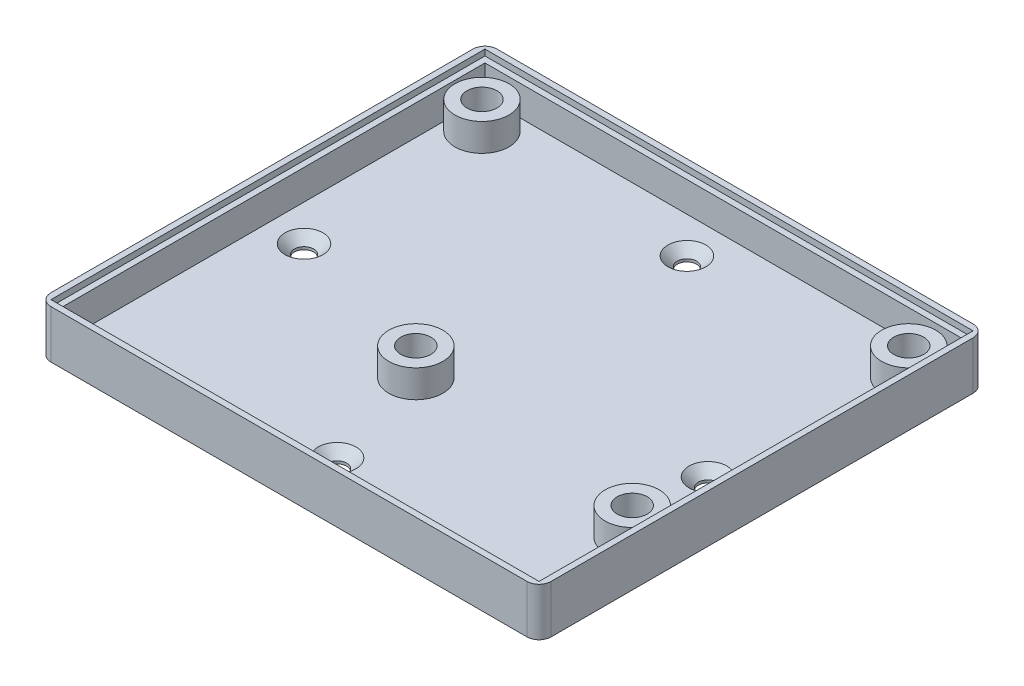
ISO-10303-21;
HEADER;
FILE_DESCRIPTION(('STEP AP214'),'2;1');
FILE_NAME('part.step','',(''),(''),'','','');
FILE_SCHEMA(('AUTOMOTIVE_DESIGN { 1 0 10303 214 1 1 1 1 }'));
ENDSEC;
DATA;
#1=APPLICATION_CONTEXT('core data for automotive mechanical design processes');
#2=APPLICATION_PROTOCOL_DEFINITION('international standard','automotive_design',2000,#1);
#3=PRODUCT_CONTEXT('',#1,'mechanical');
#4=PRODUCT('Part','Part','',(#3));
#5=PRODUCT_RELATED_PRODUCT_CATEGORY('part','',(#4));
#6=PRODUCT_DEFINITION_FORMATION('','',#4);
#7=PRODUCT_DEFINITION_CONTEXT('part definition',#1,'design');
#8=PRODUCT_DEFINITION('design','',#6,#7);
#9=PRODUCT_DEFINITION_SHAPE('','',#8);
#10=(LENGTH_UNIT() NAMED_UNIT(*) SI_UNIT(.MILLI.,.METRE.));
#11=(NAMED_UNIT(*) PLANE_ANGLE_UNIT() SI_UNIT($,.RADIAN.));
#12=(NAMED_UNIT(*) SI_UNIT($,.STERADIAN.) SOLID_ANGLE_UNIT());
#13=UNCERTAINTY_MEASURE_WITH_UNIT(LENGTH_MEASURE(1.E-05),#10,'distance_accuracy_value','');
#14=(GEOMETRIC_REPRESENTATION_CONTEXT(3) GLOBAL_UNCERTAINTY_ASSIGNED_CONTEXT((#13)) GLOBAL_UNIT_ASSIGNED_CONTEXT((#10,
#11,#12)) REPRESENTATION_CONTEXT('',''));
#15=CARTESIAN_POINT('',(0.,0.,0.));
#16=DIRECTION('',(0.,0.,1.));
#17=DIRECTION('',(1.,0.,0.));
#18=AXIS2_PLACEMENT_3D('',#15,#16,#17);
#19=CARTESIAN_POINT('',(0.,2.,0.));
#20=DIRECTION('',(0.,-1.,0.));
#21=DIRECTION('',(0.,0.,-1.));
#22=AXIS2_PLACEMENT_3D('',#19,#20,#21);
#23=PLANE('',#22);
#24=CARTESIAN_POINT('',(41.6,2.,-66.2));
#25=DIRECTION('',(0.,1.,0.));
#26=DIRECTION('',(0.,0.,1.));
#27=AXIS2_PLACEMENT_3D('',#24,#25,#26);
#28=CIRCLE('',#27,3.15);
#29=CARTESIAN_POINT('',(41.6,2.,-63.05));
#30=VERTEX_POINT('',#29);
#31=EDGE_CURVE('E1157',#30,#30,#28,.T.);
#32=ORIENTED_EDGE('',*,*,#31,.F.);
#33=EDGE_LOOP('',(#32));
#34=FACE_BOUND('',#33,.T.);
#35=CARTESIAN_POINT('',(8.,2.,-36.1));
#36=DIRECTION('',(0.,1.,0.));
#37=DIRECTION('',(0.,0.,1.));
#38=AXIS2_PLACEMENT_3D('',#35,#36,#37);
#39=CIRCLE('',#38,3.15);
#40=CARTESIAN_POINT('',(8.,2.,-32.95));
#41=VERTEX_POINT('',#40);
#42=EDGE_CURVE('E1145',#41,#41,#39,.T.);
#43=ORIENTED_EDGE('',*,*,#42,.F.);
#44=EDGE_LOOP('',(#43));
#45=FACE_BOUND('',#44,.T.);
#46=CARTESIAN_POINT('',(41.6,2.,-8.));
#47=DIRECTION('',(0.,1.,0.));
#48=DIRECTION('',(0.,0.,1.));
#49=AXIS2_PLACEMENT_3D('',#46,#47,#48);
#50=CIRCLE('',#49,3.15);
#51=CARTESIAN_POINT('',(41.6,2.,-4.85));
#52=VERTEX_POINT('',#51);
#53=EDGE_CURVE('E1092',#52,#52,#50,.T.);
#54=ORIENTED_EDGE('',*,*,#53,.F.);
#55=EDGE_LOOP('',(#54));
#56=FACE_BOUND('',#55,.T.);
#57=CARTESIAN_POINT('',(77.6,2.,-21.1));
#58=DIRECTION('',(0.,-1.,0.));
#59=DIRECTION('',(0.,0.,-1.));
#60=AXIS2_PLACEMENT_3D('',#57,#58,#59);
#61=CIRCLE('',#60,4.5);
#62=CARTESIAN_POINT('',(81.2,2.,-23.8));
#63=VERTEX_POINT('',#62);
#64=CARTESIAN_POINT('',(81.2,2.,-18.4));
#65=VERTEX_POINT('',#64);
#66=EDGE_CURVE('E373',#63,#65,#61,.F.);
#67=ORIENTED_EDGE('',*,*,#66,.F.);
#68=DIRECTION('',(0.,0.,-1.));
#69=VECTOR('',#68,1.);
#70=CARTESIAN_POINT('',(81.2,2.,0.));
#71=LINE('',#70,#69);
#72=CARTESIAN_POINT('',(81.2,2.,-64.4));
#73=VERTEX_POINT('',#72);
#74=EDGE_CURVE('E324',#63,#73,#71,.T.);
#75=ORIENTED_EDGE('',*,*,#74,.T.);
#76=CARTESIAN_POINT('',(77.6,2.,-67.1));
#77=DIRECTION('',(0.,-1.,0.));
#78=DIRECTION('',(0.,0.,-1.));
#79=AXIS2_PLACEMENT_3D('',#76,#77,#78);
#80=CIRCLE('',#79,4.50000000000001);
#81=CARTESIAN_POINT('',(81.2,2.,-69.8));
#82=VERTEX_POINT('',#81);
#83=EDGE_CURVE('E366',#82,#73,#80,.F.);
#84=ORIENTED_EDGE('',*,*,#83,.F.);
#85=CARTESIAN_POINT('',(81.2,2.,-72.2));
#86=VERTEX_POINT('',#85);
#87=EDGE_CURVE('E318',#82,#86,#71,.T.);
#88=ORIENTED_EDGE('',*,*,#87,.T.);
#89=DIRECTION('',(-1.,0.,0.));
#90=VECTOR('',#89,1.);
#91=CARTESIAN_POINT('',(0.,2.,-72.2));
#92=LINE('',#91,#90);
#93=CARTESIAN_POINT('',(2.,2.,-72.2));
#94=VERTEX_POINT('',#93);
#95=EDGE_CURVE('E314',#86,#94,#92,.T.);
#96=ORIENTED_EDGE('',*,*,#95,.T.);
#97=DIRECTION('',(0.,0.,1.));
#98=VECTOR('',#97,1.);
#99=CARTESIAN_POINT('',(2.,2.,0.));
#100=LINE('',#99,#98);
#101=CARTESIAN_POINT('',(2.,2.,-2.));
#102=VERTEX_POINT('',#101);
#103=EDGE_CURVE('E300',#94,#102,#100,.T.);
#104=ORIENTED_EDGE('',*,*,#103,.T.);
#105=DIRECTION('',(1.,0.,0.));
#106=VECTOR('',#105,1.);
#107=CARTESIAN_POINT('',(0.,2.,-2.));
#108=LINE('',#107,#106);
#109=CARTESIAN_POINT('',(81.2,2.,-2.));
#110=VERTEX_POINT('',#109);
#111=EDGE_CURVE('E304',#102,#110,#108,.T.);
#112=ORIENTED_EDGE('',*,*,#111,.T.);
#113=EDGE_CURVE('E321',#110,#65,#71,.T.);
#114=ORIENTED_EDGE('',*,*,#113,.T.);
#115=EDGE_LOOP('',(#67,#75,#84,#88,#96,#104,#112,#114));
#116=FACE_BOUND('',#115,.T.);
#117=CARTESIAN_POINT('',(36.6,2.,-26.1));
#118=DIRECTION('',(0.,-1.,0.));
#119=DIRECTION('',(0.,0.,-1.));
#120=AXIS2_PLACEMENT_3D('',#117,#118,#119);
#121=CIRCLE('',#120,4.5);
#122=CARTESIAN_POINT('',(36.6,2.,-30.6));
#123=VERTEX_POINT('',#122);
#124=EDGE_CURVE('E362',#123,#123,#121,.F.);
#125=ORIENTED_EDGE('',*,*,#124,.F.);
#126=EDGE_LOOP('',(#125));
#127=FACE_BOUND('',#126,.T.);
#128=CARTESIAN_POINT('',(6.6,2.,-67.1));
#129=DIRECTION('',(0.,-1.,0.));
#130=DIRECTION('',(0.,0.,-1.));
#131=AXIS2_PLACEMENT_3D('',#128,#129,#130);
#132=CIRCLE('',#131,4.5);
#133=CARTESIAN_POINT('',(6.6,2.,-71.6));
#134=VERTEX_POINT('',#133);
#135=EDGE_CURVE('E345',#134,#134,#132,.F.);
#136=ORIENTED_EDGE('',*,*,#135,.F.);
#137=EDGE_LOOP('',(#136));
#138=FACE_BOUND('',#137,.T.);
#139=CARTESIAN_POINT('',(75.2,2.,-36.1));
#140=DIRECTION('',(0.,1.,0.));
#141=DIRECTION('',(0.,0.,1.));
#142=AXIS2_PLACEMENT_3D('',#139,#140,#141);
#143=CIRCLE('',#142,3.15);
#144=CARTESIAN_POINT('',(75.2,2.,-32.95));
#145=VERTEX_POINT('',#144);
#146=EDGE_CURVE('E1073',#145,#145,#143,.T.);
#147=ORIENTED_EDGE('',*,*,#146,.F.);
#148=EDGE_LOOP('',(#147));
#149=FACE_BOUND('',#148,.T.);
#150=ADVANCED_FACE('F46',(#34,#45,#56,#116,#127,#138,#149),#23,.F.);
#151=CARTESIAN_POINT('',(81.2,8.,0.));
#152=DIRECTION('',(-1.,0.,0.));
#153=DIRECTION('',(0.,0.,1.));
#154=AXIS2_PLACEMENT_3D('',#151,#152,#153);
#155=PLANE('',#154);
#156=DIRECTION('',(0.,-1.,0.));
#157=VECTOR('',#156,1.);
#158=CARTESIAN_POINT('',(81.2,8.,-2.));
#159=LINE('',#158,#157);
#160=CARTESIAN_POINT('',(81.2,7.,-2.));
#161=VERTEX_POINT('',#160);
#162=EDGE_CURVE('E309',#161,#110,#159,.T.);
#163=ORIENTED_EDGE('',*,*,#162,.F.);
#164=DIRECTION('',(0.,0.,-1.));
#165=VECTOR('',#164,1.);
#166=CARTESIAN_POINT('',(81.2,7.,0.));
#167=LINE('',#166,#165);
#168=CARTESIAN_POINT('',(81.2,7.,-72.2));
#169=VERTEX_POINT('',#168);
#170=EDGE_CURVE('E246',#161,#169,#167,.T.);
#171=ORIENTED_EDGE('',*,*,#170,.T.);
#172=DIRECTION('',(0.,-1.,0.));
#173=VECTOR('',#172,1.);
#174=CARTESIAN_POINT('',(81.2,8.,-72.2));
#175=LINE('',#174,#173);
#176=EDGE_CURVE('E313',#169,#86,#175,.T.);
#177=ORIENTED_EDGE('',*,*,#176,.T.);
#178=ORIENTED_EDGE('',*,*,#87,.F.);
#179=DIRECTION('',(0.,-1.,0.));
#180=VECTOR('',#179,1.);
#181=CARTESIAN_POINT('',(81.2,20.7279220613579,-69.8));
#182=LINE('',#181,#180);
#183=CARTESIAN_POINT('',(81.2,6.6,-69.8));
#184=VERTEX_POINT('',#183);
#185=EDGE_CURVE('E281',#82,#184,#182,.F.);
#186=ORIENTED_EDGE('',*,*,#185,.T.);
#187=DIRECTION('',(0.,0.,1.));
#188=VECTOR('',#187,1.);
#189=CARTESIAN_POINT('',(81.2,6.6,0.));
#190=LINE('',#189,#188);
#191=CARTESIAN_POINT('',(81.2,6.6,-64.4));
#192=VERTEX_POINT('',#191);
#193=EDGE_CURVE('E370',#184,#192,#190,.T.);
#194=ORIENTED_EDGE('',*,*,#193,.T.);
#195=DIRECTION('',(0.,-1.,0.));
#196=VECTOR('',#195,1.);
#197=CARTESIAN_POINT('',(81.2,20.7279220613579,-64.4));
#198=LINE('',#197,#196);
#199=EDGE_CURVE('E277',#192,#73,#198,.T.);
#200=ORIENTED_EDGE('',*,*,#199,.T.);
#201=ORIENTED_EDGE('',*,*,#74,.F.);
#202=DIRECTION('',(0.,-1.,0.));
#203=VECTOR('',#202,1.);
#204=CARTESIAN_POINT('',(81.2,20.7279220613579,-23.8));
#205=LINE('',#204,#203);
#206=CARTESIAN_POINT('',(81.2,6.6,-23.8));
#207=VERTEX_POINT('',#206);
#208=EDGE_CURVE('E266',#63,#207,#205,.F.);
#209=ORIENTED_EDGE('',*,*,#208,.T.);
#210=DIRECTION('',(0.,0.,1.));
#211=VECTOR('',#210,1.);
#212=CARTESIAN_POINT('',(81.2,6.6,0.));
#213=LINE('',#212,#211);
#214=CARTESIAN_POINT('',(81.2,6.6,-18.4));
#215=VERTEX_POINT('',#214);
#216=EDGE_CURVE('E377',#207,#215,#213,.T.);
#217=ORIENTED_EDGE('',*,*,#216,.T.);
#218=DIRECTION('',(0.,-1.,0.));
#219=VECTOR('',#218,1.);
#220=CARTESIAN_POINT('',(81.2,20.7279220613579,-18.4));
#221=LINE('',#220,#219);
#222=EDGE_CURVE('E262',#215,#65,#221,.T.);
#223=ORIENTED_EDGE('',*,*,#222,.T.);
#224=ORIENTED_EDGE('',*,*,#113,.F.);
#225=EDGE_LOOP('',(#163,#171,#177,#178,#186,#194,#200,#201,#209,#217,#223,#224));
#226=FACE_BOUND('',#225,.T.);
#227=ADVANCED_FACE('F483',(#226),#155,.T.);
#228=CARTESIAN_POINT('',(2.,8.,0.));
#229=DIRECTION('',(1.,0.,0.));
#230=DIRECTION('',(0.,0.,-1.));
#231=AXIS2_PLACEMENT_3D('',#228,#229,#230);
#232=PLANE('',#231);
#233=DIRECTION('',(0.,-1.,0.));
#234=VECTOR('',#233,1.);
#235=CARTESIAN_POINT('',(2.,8.,-72.2));
#236=LINE('',#235,#234);
#237=CARTESIAN_POINT('',(2.,7.,-72.2));
#238=VERTEX_POINT('',#237);
#239=EDGE_CURVE('E310',#238,#94,#236,.T.);
#240=ORIENTED_EDGE('',*,*,#239,.F.);
#241=DIRECTION('',(0.,0.,1.));
#242=VECTOR('',#241,1.);
#243=CARTESIAN_POINT('',(2.,7.,0.));
#244=LINE('',#243,#242);
#245=CARTESIAN_POINT('',(2.,7.,-2.));
#246=VERTEX_POINT('',#245);
#247=EDGE_CURVE('E237',#238,#246,#244,.T.);
#248=ORIENTED_EDGE('',*,*,#247,.T.);
#249=DIRECTION('',(0.,-1.,0.));
#250=VECTOR('',#249,1.);
#251=CARTESIAN_POINT('',(2.,8.,-2.));
#252=LINE('',#251,#250);
#253=EDGE_CURVE('E305',#246,#102,#252,.T.);
#254=ORIENTED_EDGE('',*,*,#253,.T.);
#255=ORIENTED_EDGE('',*,*,#103,.F.);
#256=EDGE_LOOP('',(#240,#248,#254,#255));
#257=FACE_BOUND('',#256,.T.);
#258=ADVANCED_FACE('F491',(#257),#232,.T.);
#259=CARTESIAN_POINT('',(0.,8.,-2.));
#260=DIRECTION('',(0.,0.,-1.));
#261=DIRECTION('',(-1.,0.,0.));
#262=AXIS2_PLACEMENT_3D('',#259,#260,#261);
#263=PLANE('',#262);
#264=ORIENTED_EDGE('',*,*,#253,.F.);
#265=DIRECTION('',(1.,0.,0.));
#266=VECTOR('',#265,1.);
#267=CARTESIAN_POINT('',(0.,7.,-2.));
#268=LINE('',#267,#266);
#269=EDGE_CURVE('E250',#246,#161,#268,.T.);
#270=ORIENTED_EDGE('',*,*,#269,.T.);
#271=ORIENTED_EDGE('',*,*,#162,.T.);
#272=ORIENTED_EDGE('',*,*,#111,.F.);
#273=EDGE_LOOP('',(#264,#270,#271,#272));
#274=FACE_BOUND('',#273,.T.);
#275=ADVANCED_FACE('F777',(#274),#263,.T.);
#276=CARTESIAN_POINT('',(0.,8.,-72.2));
#277=DIRECTION('',(0.,0.,1.));
#278=DIRECTION('',(1.,0.,0.));
#279=AXIS2_PLACEMENT_3D('',#276,#277,#278);
#280=PLANE('',#279);
#281=ORIENTED_EDGE('',*,*,#176,.F.);
#282=DIRECTION('',(-1.,0.,0.));
#283=VECTOR('',#282,1.);
#284=CARTESIAN_POINT('',(0.,7.,-72.2));
#285=LINE('',#284,#283);
#286=EDGE_CURVE('E380',#169,#238,#285,.T.);
#287=ORIENTED_EDGE('',*,*,#286,.T.);
#288=ORIENTED_EDGE('',*,*,#239,.T.);
#289=ORIENTED_EDGE('',*,*,#95,.F.);
#290=EDGE_LOOP('',(#281,#287,#288,#289));
#291=FACE_BOUND('',#290,.T.);
#292=ADVANCED_FACE('F498',(#291),#280,.T.);
#293=CARTESIAN_POINT('',(6.6,20.7279220613579,-67.1));
#294=DIRECTION('',(0.,-1.,0.));
#295=DIRECTION('',(0.,0.,-1.));
#296=AXIS2_PLACEMENT_3D('',#293,#294,#295);
#297=CYLINDRICAL_SURFACE('',#296,4.5);
#298=CARTESIAN_POINT('',(6.6,6.6,-67.1));
#299=DIRECTION('',(0.,-1.,0.));
#300=DIRECTION('',(0.,0.,-1.));
#301=AXIS2_PLACEMENT_3D('',#298,#299,#300);
#302=CIRCLE('',#301,4.5);
#303=CARTESIAN_POINT('',(6.6,6.6,-71.6));
#304=VERTEX_POINT('',#303);
#305=EDGE_CURVE('E292',#304,#304,#302,.T.);
#306=ORIENTED_EDGE('',*,*,#305,.T.);
#307=EDGE_LOOP('',(#306));
#308=FACE_BOUND('',#307,.T.);
#309=ORIENTED_EDGE('',*,*,#135,.T.);
#310=EDGE_LOOP('',(#309));
#311=FACE_BOUND('',#310,.T.);
#312=ADVANCED_FACE('F799',(#308,#311),#297,.T.);
#313=CARTESIAN_POINT('',(6.6,20.7279220613579,-67.1));
#314=DIRECTION('',(0.,-1.,0.));
#315=DIRECTION('',(0.,0.,-1.));
#316=AXIS2_PLACEMENT_3D('',#313,#314,#315);
#317=CYLINDRICAL_SURFACE('',#316,2.5);
#318=CARTESIAN_POINT('',(6.6,2.5,-67.1));
#319=DIRECTION('',(0.,1.,0.));
#320=DIRECTION('',(0.,0.,1.));
#321=AXIS2_PLACEMENT_3D('',#318,#319,#320);
#322=CIRCLE('',#321,2.5);
#323=CARTESIAN_POINT('',(6.6,2.5,-64.6));
#324=VERTEX_POINT('',#323);
#325=EDGE_CURVE('E384',#324,#324,#322,.T.);
#326=ORIENTED_EDGE('',*,*,#325,.F.);
#327=EDGE_LOOP('',(#326));
#328=FACE_BOUND('',#327,.T.);
#329=CARTESIAN_POINT('',(6.6,6.6,-67.1));
#330=DIRECTION('',(0.,-1.,0.));
#331=DIRECTION('',(0.,0.,-1.));
#332=AXIS2_PLACEMENT_3D('',#329,#330,#331);
#333=CIRCLE('',#332,2.5);
#334=CARTESIAN_POINT('',(6.6,6.6,-69.6));
#335=VERTEX_POINT('',#334);
#336=EDGE_CURVE('E296',#335,#335,#333,.T.);
#337=ORIENTED_EDGE('',*,*,#336,.F.);
#338=EDGE_LOOP('',(#337));
#339=FACE_BOUND('',#338,.T.);
#340=ADVANCED_FACE('F918',(#328,#339),#317,.F.);
#341=CARTESIAN_POINT('',(0.,6.6,0.));
#342=DIRECTION('',(0.,-1.,0.));
#343=DIRECTION('',(0.,0.,-1.));
#344=AXIS2_PLACEMENT_3D('',#341,#342,#343);
#345=PLANE('',#344);
#346=ORIENTED_EDGE('',*,*,#336,.T.);
#347=EDGE_LOOP('',(#346));
#348=FACE_BOUND('',#347,.T.);
#349=ORIENTED_EDGE('',*,*,#305,.F.);
#350=EDGE_LOOP('',(#349));
#351=FACE_BOUND('',#350,.T.);
#352=ADVANCED_FACE('F907',(#348,#351),#345,.F.);
#353=CARTESIAN_POINT('',(36.6,20.7279220613579,-26.1));
#354=DIRECTION('',(0.,-1.,0.));
#355=DIRECTION('',(0.,0.,-1.));
#356=AXIS2_PLACEMENT_3D('',#353,#354,#355);
#357=CYLINDRICAL_SURFACE('',#356,4.5);
#358=CARTESIAN_POINT('',(36.6,6.6,-26.1));
#359=DIRECTION('',(0.,-1.,0.));
#360=DIRECTION('',(0.,0.,-1.));
#361=AXIS2_PLACEMENT_3D('',#358,#359,#360);
#362=CIRCLE('',#361,4.5);
#363=CARTESIAN_POINT('',(36.6,6.6,-30.6));
#364=VERTEX_POINT('',#363);
#365=EDGE_CURVE('E288',#364,#364,#362,.T.);
#366=ORIENTED_EDGE('',*,*,#365,.T.);
#367=EDGE_LOOP('',(#366));
#368=FACE_BOUND('',#367,.T.);
#369=ORIENTED_EDGE('',*,*,#124,.T.);
#370=EDGE_LOOP('',(#369));
#371=FACE_BOUND('',#370,.T.);
#372=ADVANCED_FACE('F895',(#368,#371),#357,.T.);
#373=CARTESIAN_POINT('',(36.6,20.7279220613579,-26.1));
#374=DIRECTION('',(0.,-1.,0.));
#375=DIRECTION('',(0.,0.,-1.));
#376=AXIS2_PLACEMENT_3D('',#373,#374,#375);
#377=CYLINDRICAL_SURFACE('',#376,2.49999999999999);
#378=CARTESIAN_POINT('',(36.6,2.5,-26.1));
#379=DIRECTION('',(0.,1.,0.));
#380=DIRECTION('',(0.,0.,1.));
#381=AXIS2_PLACEMENT_3D('',#378,#379,#380);
#382=CIRCLE('',#381,2.49999999999999);
#383=CARTESIAN_POINT('',(36.6,2.5,-23.6));
#384=VERTEX_POINT('',#383);
#385=EDGE_CURVE('E392',#384,#384,#382,.T.);
#386=ORIENTED_EDGE('',*,*,#385,.F.);
#387=EDGE_LOOP('',(#386));
#388=FACE_BOUND('',#387,.T.);
#389=CARTESIAN_POINT('',(36.6,6.6,-26.1));
#390=DIRECTION('',(0.,-1.,0.));
#391=DIRECTION('',(0.,0.,-1.));
#392=AXIS2_PLACEMENT_3D('',#389,#390,#391);
#393=CIRCLE('',#392,2.49999999999999);
#394=CARTESIAN_POINT('',(36.6,6.6,-28.6));
#395=VERTEX_POINT('',#394);
#396=EDGE_CURVE('E284',#395,#395,#393,.T.);
#397=ORIENTED_EDGE('',*,*,#396,.F.);
#398=EDGE_LOOP('',(#397));
#399=FACE_BOUND('',#398,.T.);
#400=ADVANCED_FACE('F882',(#388,#399),#377,.F.);
#401=CARTESIAN_POINT('',(0.,6.6,0.));
#402=DIRECTION('',(0.,-1.,0.));
#403=DIRECTION('',(0.,0.,-1.));
#404=AXIS2_PLACEMENT_3D('',#401,#402,#403);
#405=PLANE('',#404);
#406=ORIENTED_EDGE('',*,*,#396,.T.);
#407=EDGE_LOOP('',(#406));
#408=FACE_BOUND('',#407,.T.);
#409=ORIENTED_EDGE('',*,*,#365,.F.);
#410=EDGE_LOOP('',(#409));
#411=FACE_BOUND('',#410,.T.);
#412=ADVANCED_FACE('F871',(#408,#411),#405,.F.);
#413=CARTESIAN_POINT('',(77.6,20.7279220613579,-67.1));
#414=DIRECTION('',(0.,-1.,0.));
#415=DIRECTION('',(0.,0.,-1.));
#416=AXIS2_PLACEMENT_3D('',#413,#414,#415);
#417=CYLINDRICAL_SURFACE('',#416,4.50000000000001);
#418=ORIENTED_EDGE('',*,*,#185,.F.);
#419=ORIENTED_EDGE('',*,*,#83,.T.);
#420=ORIENTED_EDGE('',*,*,#199,.F.);
#421=CARTESIAN_POINT('',(77.6,6.6,-67.1));
#422=DIRECTION('',(0.,-1.,0.));
#423=DIRECTION('',(0.,0.,-1.));
#424=AXIS2_PLACEMENT_3D('',#421,#422,#423);
#425=CIRCLE('',#424,4.50000000000001);
#426=EDGE_CURVE('E273',#192,#184,#425,.T.);
#427=ORIENTED_EDGE('',*,*,#426,.T.);
#428=EDGE_LOOP('',(#418,#419,#420,#427));
#429=FACE_BOUND('',#428,.T.);
#430=ADVANCED_FACE('F859',(#429),#417,.T.);
#431=CARTESIAN_POINT('',(77.6,20.7279220613579,-67.1));
#432=DIRECTION('',(0.,-1.,0.));
#433=DIRECTION('',(0.,0.,-1.));
#434=AXIS2_PLACEMENT_3D('',#431,#432,#433);
#435=CYLINDRICAL_SURFACE('',#434,2.50000000000001);
#436=CARTESIAN_POINT('',(77.6,2.5,-67.1));
#437=DIRECTION('',(0.,1.,0.));
#438=DIRECTION('',(0.,0.,1.));
#439=AXIS2_PLACEMENT_3D('',#436,#437,#438);
#440=CIRCLE('',#439,2.50000000000001);
#441=CARTESIAN_POINT('',(77.6,2.5,-64.6));
#442=VERTEX_POINT('',#441);
#443=EDGE_CURVE('E388',#442,#442,#440,.T.);
#444=ORIENTED_EDGE('',*,*,#443,.F.);
#445=EDGE_LOOP('',(#444));
#446=FACE_BOUND('',#445,.T.);
#447=CARTESIAN_POINT('',(77.6,6.6,-67.1));
#448=DIRECTION('',(0.,-1.,0.));
#449=DIRECTION('',(0.,0.,-1.));
#450=AXIS2_PLACEMENT_3D('',#447,#448,#449);
#451=CIRCLE('',#450,2.50000000000001);
#452=CARTESIAN_POINT('',(77.6,6.6,-69.6));
#453=VERTEX_POINT('',#452);
#454=EDGE_CURVE('E269',#453,#453,#451,.T.);
#455=ORIENTED_EDGE('',*,*,#454,.F.);
#456=EDGE_LOOP('',(#455));
#457=FACE_BOUND('',#456,.T.);
#458=ADVANCED_FACE('F846',(#446,#457),#435,.F.);
#459=CARTESIAN_POINT('',(0.,6.6,0.));
#460=DIRECTION('',(0.,-1.,0.));
#461=DIRECTION('',(0.,0.,-1.));
#462=AXIS2_PLACEMENT_3D('',#459,#460,#461);
#463=PLANE('',#462);
#464=ORIENTED_EDGE('',*,*,#193,.F.);
#465=ORIENTED_EDGE('',*,*,#426,.F.);
#466=EDGE_LOOP('',(#464,#465));
#467=FACE_BOUND('',#466,.T.);
#468=ORIENTED_EDGE('',*,*,#454,.T.);
#469=EDGE_LOOP('',(#468));
#470=FACE_BOUND('',#469,.T.);
#471=ADVANCED_FACE('F835',(#467,#470),#463,.F.);
#472=CARTESIAN_POINT('',(77.6,20.7279220613579,-21.1));
#473=DIRECTION('',(0.,-1.,0.));
#474=DIRECTION('',(0.,0.,-1.));
#475=AXIS2_PLACEMENT_3D('',#472,#473,#474);
#476=CYLINDRICAL_SURFACE('',#475,4.5);
#477=ORIENTED_EDGE('',*,*,#208,.F.);
#478=ORIENTED_EDGE('',*,*,#66,.T.);
#479=ORIENTED_EDGE('',*,*,#222,.F.);
#480=CARTESIAN_POINT('',(77.6,6.6,-21.1));
#481=DIRECTION('',(0.,-1.,0.));
#482=DIRECTION('',(0.,0.,-1.));
#483=AXIS2_PLACEMENT_3D('',#480,#481,#482);
#484=CIRCLE('',#483,4.5);
#485=EDGE_CURVE('E258',#215,#207,#484,.T.);
#486=ORIENTED_EDGE('',*,*,#485,.T.);
#487=EDGE_LOOP('',(#477,#478,#479,#486));
#488=FACE_BOUND('',#487,.T.);
#489=ADVANCED_FACE('F823',(#488),#476,.T.);
#490=CARTESIAN_POINT('',(77.6,20.7279220613579,-21.1));
#491=DIRECTION('',(0.,-1.,0.));
#492=DIRECTION('',(0.,0.,-1.));
#493=AXIS2_PLACEMENT_3D('',#490,#491,#492);
#494=CYLINDRICAL_SURFACE('',#493,2.50000000000001);
#495=CARTESIAN_POINT('',(77.6,2.5,-21.1));
#496=DIRECTION('',(0.,1.,0.));
#497=DIRECTION('',(0.,0.,1.));
#498=AXIS2_PLACEMENT_3D('',#495,#496,#497);
#499=CIRCLE('',#498,2.50000000000001);
#500=CARTESIAN_POINT('',(77.6,2.5,-18.6));
#501=VERTEX_POINT('',#500);
#502=EDGE_CURVE('E396',#501,#501,#499,.T.);
#503=ORIENTED_EDGE('',*,*,#502,.F.);
#504=EDGE_LOOP('',(#503));
#505=FACE_BOUND('',#504,.T.);
#506=CARTESIAN_POINT('',(77.6,6.6,-21.1));
#507=DIRECTION('',(0.,-1.,0.));
#508=DIRECTION('',(0.,0.,-1.));
#509=AXIS2_PLACEMENT_3D('',#506,#507,#508);
#510=CIRCLE('',#509,2.50000000000001);
#511=CARTESIAN_POINT('',(77.6,6.6,-23.6));
#512=VERTEX_POINT('',#511);
#513=EDGE_CURVE('E254',#512,#512,#510,.T.);
#514=ORIENTED_EDGE('',*,*,#513,.F.);
#515=EDGE_LOOP('',(#514));
#516=FACE_BOUND('',#515,.T.);
#517=ADVANCED_FACE('F811',(#505,#516),#494,.F.);
#518=CARTESIAN_POINT('',(0.,6.6,0.));
#519=DIRECTION('',(0.,-1.,0.));
#520=DIRECTION('',(0.,0.,-1.));
#521=AXIS2_PLACEMENT_3D('',#518,#519,#520);
#522=PLANE('',#521);
#523=ORIENTED_EDGE('',*,*,#216,.F.);
#524=ORIENTED_EDGE('',*,*,#485,.F.);
#525=EDGE_LOOP('',(#523,#524));
#526=FACE_BOUND('',#525,.T.);
#527=ORIENTED_EDGE('',*,*,#513,.T.);
#528=EDGE_LOOP('',(#527));
#529=FACE_BOUND('',#528,.T.);
#530=ADVANCED_FACE('F756',(#526,#529),#522,.F.);
#531=CARTESIAN_POINT('',(82.2,7.,-73.2));
#532=DIRECTION('',(0.,0.,-1.));
#533=DIRECTION('',(-1.,0.,0.));
#534=AXIS2_PLACEMENT_3D('',#531,#532,#533);
#535=PLANE('',#534);
#536=DIRECTION('',(-1.,0.,0.));
#537=VECTOR('',#536,1.);
#538=CARTESIAN_POINT('',(82.2,8.,-73.2));
#539=LINE('',#538,#537);
#540=CARTESIAN_POINT('',(82.2,8.,-73.2));
#541=VERTEX_POINT('',#540);
#542=CARTESIAN_POINT('',(1.,8.,-73.2));
#543=VERTEX_POINT('',#542);
#544=EDGE_CURVE('E192',#541,#543,#539,.T.);
#545=ORIENTED_EDGE('',*,*,#544,.T.);
#546=DIRECTION('',(0.,1.,0.));
#547=VECTOR('',#546,1.);
#548=CARTESIAN_POINT('',(1.,7.,-73.2));
#549=LINE('',#548,#547);
#550=CARTESIAN_POINT('',(1.,7.,-73.2));
#551=VERTEX_POINT('',#550);
#552=EDGE_CURVE('E185',#551,#543,#549,.T.);
#553=ORIENTED_EDGE('',*,*,#552,.F.);
#554=DIRECTION('',(-1.,0.,0.));
#555=VECTOR('',#554,1.);
#556=CARTESIAN_POINT('',(82.2,7.,-73.2));
#557=LINE('',#556,#555);
#558=CARTESIAN_POINT('',(82.2,7.,-73.2));
#559=VERTEX_POINT('',#558);
#560=EDGE_CURVE('E189',#559,#551,#557,.T.);
#561=ORIENTED_EDGE('',*,*,#560,.F.);
#562=DIRECTION('',(0.,1.,0.));
#563=VECTOR('',#562,1.);
#564=CARTESIAN_POINT('',(82.2,7.,-73.2));
#565=LINE('',#564,#563);
#566=EDGE_CURVE('E234',#559,#541,#565,.T.);
#567=ORIENTED_EDGE('',*,*,#566,.T.);
#568=EDGE_LOOP('',(#545,#553,#561,#567));
#569=FACE_BOUND('',#568,.T.);
#570=ADVANCED_FACE('F187',(#569),#535,.F.);
#571=CARTESIAN_POINT('',(82.2,7.,-1.));
#572=DIRECTION('',(1.,0.,0.));
#573=DIRECTION('',(0.,0.,-1.));
#574=AXIS2_PLACEMENT_3D('',#571,#572,#573);
#575=PLANE('',#574);
#576=DIRECTION('',(0.,0.,-1.));
#577=VECTOR('',#576,1.);
#578=CARTESIAN_POINT('',(82.2,8.,-1.));
#579=LINE('',#578,#577);
#580=CARTESIAN_POINT('',(82.2,8.,-1.));
#581=VERTEX_POINT('',#580);
#582=EDGE_CURVE('E212',#581,#541,#579,.T.);
#583=ORIENTED_EDGE('',*,*,#582,.T.);
#584=ORIENTED_EDGE('',*,*,#566,.F.);
#585=DIRECTION('',(0.,0.,-1.));
#586=VECTOR('',#585,1.);
#587=CARTESIAN_POINT('',(82.2,7.,-1.));
#588=LINE('',#587,#586);
#589=CARTESIAN_POINT('',(82.2,7.,-1.));
#590=VERTEX_POINT('',#589);
#591=EDGE_CURVE('E198',#590,#559,#588,.T.);
#592=ORIENTED_EDGE('',*,*,#591,.F.);
#593=DIRECTION('',(0.,1.,0.));
#594=VECTOR('',#593,1.);
#595=CARTESIAN_POINT('',(82.2,7.,-1.));
#596=LINE('',#595,#594);
#597=EDGE_CURVE('E238',#590,#581,#596,.T.);
#598=ORIENTED_EDGE('',*,*,#597,.T.);
#599=EDGE_LOOP('',(#583,#584,#592,#598));
#600=FACE_BOUND('',#599,.T.);
#601=ADVANCED_FACE('F733',(#600),#575,.F.);
#602=CARTESIAN_POINT('',(1.,7.,-1.));
#603=DIRECTION('',(0.,0.,1.));
#604=DIRECTION('',(1.,0.,0.));
#605=AXIS2_PLACEMENT_3D('',#602,#603,#604);
#606=PLANE('',#605);
#607=DIRECTION('',(1.,0.,0.));
#608=VECTOR('',#607,1.);
#609=CARTESIAN_POINT('',(1.,8.,-1.));
#610=LINE('',#609,#608);
#611=CARTESIAN_POINT('',(1.,8.,-1.));
#612=VERTEX_POINT('',#611);
#613=EDGE_CURVE('E216',#612,#581,#610,.T.);
#614=ORIENTED_EDGE('',*,*,#613,.T.);
#615=ORIENTED_EDGE('',*,*,#597,.F.);
#616=DIRECTION('',(1.,0.,0.));
#617=VECTOR('',#616,1.);
#618=CARTESIAN_POINT('',(1.,7.,-1.));
#619=LINE('',#618,#617);
#620=CARTESIAN_POINT('',(1.,7.,-1.));
#621=VERTEX_POINT('',#620);
#622=EDGE_CURVE('E207',#621,#590,#619,.T.);
#623=ORIENTED_EDGE('',*,*,#622,.F.);
#624=DIRECTION('',(0.,1.,0.));
#625=VECTOR('',#624,1.);
#626=CARTESIAN_POINT('',(1.,7.,-1.));
#627=LINE('',#626,#625);
#628=EDGE_CURVE('E197',#621,#612,#627,.T.);
#629=ORIENTED_EDGE('',*,*,#628,.T.);
#630=EDGE_LOOP('',(#614,#615,#623,#629));
#631=FACE_BOUND('',#630,.T.);
#632=ADVANCED_FACE('F722',(#631),#606,.F.);
#633=CARTESIAN_POINT('',(1.,7.,-73.2));
#634=DIRECTION('',(-1.,0.,0.));
#635=DIRECTION('',(0.,0.,1.));
#636=AXIS2_PLACEMENT_3D('',#633,#634,#635);
#637=PLANE('',#636);
#638=DIRECTION('',(0.,0.,1.));
#639=VECTOR('',#638,1.);
#640=CARTESIAN_POINT('',(1.,8.,-73.2));
#641=LINE('',#640,#639);
#642=EDGE_CURVE('E228',#543,#612,#641,.T.);
#643=ORIENTED_EDGE('',*,*,#642,.T.);
#644=ORIENTED_EDGE('',*,*,#628,.F.);
#645=DIRECTION('',(0.,0.,1.));
#646=VECTOR('',#645,1.);
#647=CARTESIAN_POINT('',(1.,7.,-73.2));
#648=LINE('',#647,#646);
#649=EDGE_CURVE('E201',#551,#621,#648,.T.);
#650=ORIENTED_EDGE('',*,*,#649,.F.);
#651=ORIENTED_EDGE('',*,*,#552,.T.);
#652=EDGE_LOOP('',(#643,#644,#650,#651));
#653=FACE_BOUND('',#652,.T.);
#654=ADVANCED_FACE('F202',(#653),#637,.F.);
#655=CARTESIAN_POINT('',(0.,7.,0.));
#656=DIRECTION('',(0.,1.,0.));
#657=DIRECTION('',(0.,0.,1.));
#658=AXIS2_PLACEMENT_3D('',#655,#656,#657);
#659=PLANE('',#658);
#660=ORIENTED_EDGE('',*,*,#247,.F.);
#661=ORIENTED_EDGE('',*,*,#286,.F.);
#662=ORIENTED_EDGE('',*,*,#170,.F.);
#663=ORIENTED_EDGE('',*,*,#269,.F.);
#664=EDGE_LOOP('',(#660,#661,#662,#663));
#665=FACE_BOUND('',#664,.T.);
#666=ORIENTED_EDGE('',*,*,#560,.T.);
#667=ORIENTED_EDGE('',*,*,#649,.T.);
#668=ORIENTED_EDGE('',*,*,#622,.T.);
#669=ORIENTED_EDGE('',*,*,#591,.T.);
#670=EDGE_LOOP('',(#666,#667,#668,#669));
#671=FACE_BOUND('',#670,.T.);
#672=ADVANCED_FACE('F209',(#665,#671),#659,.T.);
#673=CARTESIAN_POINT('',(0.,0.,0.));
#674=DIRECTION('',(0.,-1.,0.));
#675=DIRECTION('',(0.,0.,-1.));
#676=AXIS2_PLACEMENT_3D('',#673,#674,#675);
#677=PLANE('',#676);
#678=CARTESIAN_POINT('',(41.6,0.,-66.2));
#679=DIRECTION('',(0.,1.,0.));
#680=DIRECTION('',(0.,0.,1.));
#681=AXIS2_PLACEMENT_3D('',#678,#679,#680);
#682=CIRCLE('',#681,1.6);
#683=CARTESIAN_POINT('',(41.6,0.,-64.6));
#684=VERTEX_POINT('',#683);
#685=EDGE_CURVE('E1149',#684,#684,#682,.T.);
#686=ORIENTED_EDGE('',*,*,#685,.T.);
#687=EDGE_LOOP('',(#686));
#688=FACE_BOUND('',#687,.T.);
#689=CARTESIAN_POINT('',(8.,0.,-36.1));
#690=DIRECTION('',(0.,1.,0.));
#691=DIRECTION('',(0.,0.,1.));
#692=AXIS2_PLACEMENT_3D('',#689,#690,#691);
#693=CIRCLE('',#692,1.6);
#694=CARTESIAN_POINT('',(8.,0.,-34.5));
#695=VERTEX_POINT('',#694);
#696=EDGE_CURVE('E1077',#695,#695,#693,.T.);
#697=ORIENTED_EDGE('',*,*,#696,.T.);
#698=EDGE_LOOP('',(#697));
#699=FACE_BOUND('',#698,.T.);
#700=CARTESIAN_POINT('',(75.2,0.,-36.1));
#701=DIRECTION('',(0.,1.,0.));
#702=DIRECTION('',(0.,0.,1.));
#703=AXIS2_PLACEMENT_3D('',#700,#701,#702);
#704=CIRCLE('',#703,1.6);
#705=CARTESIAN_POINT('',(75.2,0.,-34.5));
#706=VERTEX_POINT('',#705);
#707=EDGE_CURVE('E1082',#706,#706,#704,.T.);
#708=ORIENTED_EDGE('',*,*,#707,.T.);
#709=EDGE_LOOP('',(#708));
#710=FACE_BOUND('',#709,.T.);
#711=CARTESIAN_POINT('',(41.6,0.,-8.));
#712=DIRECTION('',(0.,1.,0.));
#713=DIRECTION('',(0.,0.,1.));
#714=AXIS2_PLACEMENT_3D('',#711,#712,#713);
#715=CIRCLE('',#714,1.6);
#716=CARTESIAN_POINT('',(41.6,0.,-6.4));
#717=VERTEX_POINT('',#716);
#718=EDGE_CURVE('E219',#717,#717,#715,.T.);
#719=ORIENTED_EDGE('',*,*,#718,.T.);
#720=EDGE_LOOP('',(#719));
#721=FACE_BOUND('',#720,.T.);
#722=DIRECTION('',(0.,0.,1.));
#723=VECTOR('',#722,1.);
#724=CARTESIAN_POINT('',(0.,0.,0.));
#725=LINE('',#724,#723);
#726=CARTESIAN_POINT('',(0.,0.,-72.2));
#727=VERTEX_POINT('',#726);
#728=CARTESIAN_POINT('',(0.,0.,-2.));
#729=VERTEX_POINT('',#728);
#730=EDGE_CURVE('E308',#727,#729,#725,.T.);
#731=ORIENTED_EDGE('',*,*,#730,.F.);
#732=CARTESIAN_POINT('',(2.,0.,-72.2));
#733=DIRECTION('',(0.,-1.,0.));
#734=DIRECTION('',(0.,0.,-1.));
#735=AXIS2_PLACEMENT_3D('',#732,#733,#734);
#736=CIRCLE('',#735,2.);
#737=CARTESIAN_POINT('',(2.,0.,-74.2));
#738=VERTEX_POINT('',#737);
#739=EDGE_CURVE('E416',#727,#738,#736,.T.);
#740=ORIENTED_EDGE('',*,*,#739,.T.);
#741=DIRECTION('',(-1.,0.,0.));
#742=VECTOR('',#741,1.);
#743=CARTESIAN_POINT('',(0.,0.,-74.2));
#744=LINE('',#743,#742);
#745=CARTESIAN_POINT('',(81.2,0.,-74.2));
#746=VERTEX_POINT('',#745);
#747=EDGE_CURVE('E335',#746,#738,#744,.T.);
#748=ORIENTED_EDGE('',*,*,#747,.F.);
#749=CARTESIAN_POINT('',(81.2,0.,-72.2));
#750=DIRECTION('',(0.,-1.,0.));
#751=DIRECTION('',(0.,0.,-1.));
#752=AXIS2_PLACEMENT_3D('',#749,#750,#751);
#753=CIRCLE('',#752,2.);
#754=CARTESIAN_POINT('',(83.2,0.,-72.2));
#755=VERTEX_POINT('',#754);
#756=EDGE_CURVE('E413',#746,#755,#753,.T.);
#757=ORIENTED_EDGE('',*,*,#756,.T.);
#758=DIRECTION('',(0.,0.,-1.));
#759=VECTOR('',#758,1.);
#760=CARTESIAN_POINT('',(83.2,0.,0.));
#761=LINE('',#760,#759);
#762=CARTESIAN_POINT('',(83.2,0.,-2.));
#763=VERTEX_POINT('',#762);
#764=EDGE_CURVE('E353',#763,#755,#761,.T.);
#765=ORIENTED_EDGE('',*,*,#764,.F.);
#766=CARTESIAN_POINT('',(81.2,0.,-2.));
#767=DIRECTION('',(0.,-1.,0.));
#768=DIRECTION('',(0.,0.,-1.));
#769=AXIS2_PLACEMENT_3D('',#766,#767,#768);
#770=CIRCLE('',#769,2.);
#771=CARTESIAN_POINT('',(81.2,0.,0.));
#772=VERTEX_POINT('',#771);
#773=EDGE_CURVE('E410',#763,#772,#770,.T.);
#774=ORIENTED_EDGE('',*,*,#773,.T.);
#775=DIRECTION('',(1.,0.,0.));
#776=VECTOR('',#775,1.);
#777=CARTESIAN_POINT('',(0.,0.,0.));
#778=LINE('',#777,#776);
#779=CARTESIAN_POINT('',(2.,0.,0.));
#780=VERTEX_POINT('',#779);
#781=EDGE_CURVE('E349',#780,#772,#778,.T.);
#782=ORIENTED_EDGE('',*,*,#781,.F.);
#783=CARTESIAN_POINT('',(2.,0.,-2.));
#784=DIRECTION('',(0.,-1.,0.));
#785=DIRECTION('',(0.,0.,-1.));
#786=AXIS2_PLACEMENT_3D('',#783,#784,#785);
#787=CIRCLE('',#786,2.);
#788=EDGE_CURVE('E407',#780,#729,#787,.T.);
#789=ORIENTED_EDGE('',*,*,#788,.T.);
#790=EDGE_LOOP('',(#731,#740,#748,#757,#765,#774,#782,#789));
#791=FACE_BOUND('',#790,.T.);
#792=ADVANCED_FACE('F454',(#688,#699,#710,#721,#791),#677,.T.);
#793=CARTESIAN_POINT('',(0.,8.,-74.2));
#794=DIRECTION('',(0.,0.,1.));
#795=DIRECTION('',(1.,0.,0.));
#796=AXIS2_PLACEMENT_3D('',#793,#794,#795);
#797=PLANE('',#796);
#798=ORIENTED_EDGE('',*,*,#747,.T.);
#799=DIRECTION('',(0.,-1.,0.));
#800=VECTOR('',#799,1.);
#801=CARTESIAN_POINT('',(2.,8.,-74.2));
#802=LINE('',#801,#800);
#803=CARTESIAN_POINT('',(2.,8.,-74.2));
#804=VERTEX_POINT('',#803);
#805=EDGE_CURVE('E423',#738,#804,#802,.F.);
#806=ORIENTED_EDGE('',*,*,#805,.T.);
#807=DIRECTION('',(-1.,0.,0.));
#808=VECTOR('',#807,1.);
#809=CARTESIAN_POINT('',(0.,8.,-74.2));
#810=LINE('',#809,#808);
#811=CARTESIAN_POINT('',(81.2,8.,-74.2));
#812=VERTEX_POINT('',#811);
#813=EDGE_CURVE('E341',#812,#804,#810,.T.);
#814=ORIENTED_EDGE('',*,*,#813,.F.);
#815=DIRECTION('',(0.,-1.,0.));
#816=VECTOR('',#815,1.);
#817=CARTESIAN_POINT('',(81.2,8.,-74.2));
#818=LINE('',#817,#816);
#819=EDGE_CURVE('E419',#812,#746,#818,.T.);
#820=ORIENTED_EDGE('',*,*,#819,.T.);
#821=EDGE_LOOP('',(#798,#806,#814,#820));
#822=FACE_BOUND('',#821,.T.);
#823=ADVANCED_FACE('F468',(#822),#797,.F.);
#824=CARTESIAN_POINT('',(83.2,8.,0.));
#825=DIRECTION('',(-1.,0.,0.));
#826=DIRECTION('',(0.,0.,1.));
#827=AXIS2_PLACEMENT_3D('',#824,#825,#826);
#828=PLANE('',#827);
#829=ORIENTED_EDGE('',*,*,#764,.T.);
#830=DIRECTION('',(0.,-1.,0.));
#831=VECTOR('',#830,1.);
#832=CARTESIAN_POINT('',(83.2,8.,-72.2));
#833=LINE('',#832,#831);
#834=CARTESIAN_POINT('',(83.2,8.,-72.2));
#835=VERTEX_POINT('',#834);
#836=EDGE_CURVE('E62',#755,#835,#833,.F.);
#837=ORIENTED_EDGE('',*,*,#836,.T.);
#838=DIRECTION('',(0.,0.,-1.));
#839=VECTOR('',#838,1.);
#840=CARTESIAN_POINT('',(83.2,8.,0.));
#841=LINE('',#840,#839);
#842=CARTESIAN_POINT('',(83.2,8.,-2.));
#843=VERTEX_POINT('',#842);
#844=EDGE_CURVE('E338',#843,#835,#841,.T.);
#845=ORIENTED_EDGE('',*,*,#844,.F.);
#846=DIRECTION('',(0.,-1.,0.));
#847=VECTOR('',#846,1.);
#848=CARTESIAN_POINT('',(83.2,8.,-2.));
#849=LINE('',#848,#847);
#850=EDGE_CURVE('E437',#843,#763,#849,.T.);
#851=ORIENTED_EDGE('',*,*,#850,.T.);
#852=EDGE_LOOP('',(#829,#837,#845,#851));
#853=FACE_BOUND('',#852,.T.);
#854=ADVANCED_FACE('F459',(#853),#828,.F.);
#855=CARTESIAN_POINT('',(0.,8.,0.));
#856=DIRECTION('',(0.,0.,-1.));
#857=DIRECTION('',(-1.,0.,0.));
#858=AXIS2_PLACEMENT_3D('',#855,#856,#857);
#859=PLANE('',#858);
#860=ORIENTED_EDGE('',*,*,#781,.T.);
#861=DIRECTION('',(0.,-1.,0.));
#862=VECTOR('',#861,1.);
#863=CARTESIAN_POINT('',(81.2,8.,0.));
#864=LINE('',#863,#862);
#865=CARTESIAN_POINT('',(81.2,8.,0.));
#866=VERTEX_POINT('',#865);
#867=EDGE_CURVE('E12',#772,#866,#864,.F.);
#868=ORIENTED_EDGE('',*,*,#867,.T.);
#869=DIRECTION('',(1.,0.,0.));
#870=VECTOR('',#869,1.);
#871=CARTESIAN_POINT('',(0.,8.,0.));
#872=LINE('',#871,#870);
#873=CARTESIAN_POINT('',(2.,8.,0.));
#874=VERTEX_POINT('',#873);
#875=EDGE_CURVE('E334',#874,#866,#872,.T.);
#876=ORIENTED_EDGE('',*,*,#875,.F.);
#877=DIRECTION('',(0.,-1.,0.));
#878=VECTOR('',#877,1.);
#879=CARTESIAN_POINT('',(2.,8.,0.));
#880=LINE('',#879,#878);
#881=EDGE_CURVE('E55',#874,#780,#880,.T.);
#882=ORIENTED_EDGE('',*,*,#881,.T.);
#883=EDGE_LOOP('',(#860,#868,#876,#882));
#884=FACE_BOUND('',#883,.T.);
#885=ADVANCED_FACE('F448',(#884),#859,.F.);
#886=CARTESIAN_POINT('',(0.,8.,0.));
#887=DIRECTION('',(1.,0.,0.));
#888=DIRECTION('',(0.,0.,-1.));
#889=AXIS2_PLACEMENT_3D('',#886,#887,#888);
#890=PLANE('',#889);
#891=DIRECTION('',(0.,0.,1.));
#892=VECTOR('',#891,1.);
#893=CARTESIAN_POINT('',(0.,8.,0.));
#894=LINE('',#893,#892);
#895=CARTESIAN_POINT('',(0.,8.,-72.2));
#896=VERTEX_POINT('',#895);
#897=CARTESIAN_POINT('',(0.,8.,-2.));
#898=VERTEX_POINT('',#897);
#899=EDGE_CURVE('E330',#896,#898,#894,.T.);
#900=ORIENTED_EDGE('',*,*,#899,.F.);
#901=DIRECTION('',(0.,-1.,0.));
#902=VECTOR('',#901,1.);
#903=CARTESIAN_POINT('',(0.,8.,-72.2));
#904=LINE('',#903,#902);
#905=EDGE_CURVE('E403',#896,#727,#904,.T.);
#906=ORIENTED_EDGE('',*,*,#905,.T.);
#907=ORIENTED_EDGE('',*,*,#730,.T.);
#908=DIRECTION('',(0.,-1.,0.));
#909=VECTOR('',#908,1.);
#910=CARTESIAN_POINT('',(0.,8.,-2.));
#911=LINE('',#910,#909);
#912=EDGE_CURVE('E400',#729,#898,#911,.F.);
#913=ORIENTED_EDGE('',*,*,#912,.T.);
#914=EDGE_LOOP('',(#900,#906,#907,#913));
#915=FACE_BOUND('',#914,.T.);
#916=ADVANCED_FACE('F476',(#915),#890,.F.);
#917=CARTESIAN_POINT('',(0.,8.,0.));
#918=DIRECTION('',(0.,-1.,0.));
#919=DIRECTION('',(0.,0.,-1.));
#920=AXIS2_PLACEMENT_3D('',#917,#918,#919);
#921=PLANE('',#920);
#922=ORIENTED_EDGE('',*,*,#642,.F.);
#923=ORIENTED_EDGE('',*,*,#544,.F.);
#924=ORIENTED_EDGE('',*,*,#582,.F.);
#925=ORIENTED_EDGE('',*,*,#613,.F.);
#926=EDGE_LOOP('',(#922,#923,#924,#925));
#927=FACE_BOUND('',#926,.T.);
#928=ORIENTED_EDGE('',*,*,#813,.T.);
#929=CARTESIAN_POINT('',(2.,8.,-72.2));
#930=DIRECTION('',(0.,-1.,0.));
#931=DIRECTION('',(0.,0.,-1.));
#932=AXIS2_PLACEMENT_3D('',#929,#930,#931);
#933=CIRCLE('',#932,2.);
#934=EDGE_CURVE('E434',#804,#896,#933,.F.);
#935=ORIENTED_EDGE('',*,*,#934,.T.);
#936=ORIENTED_EDGE('',*,*,#899,.T.);
#937=CARTESIAN_POINT('',(2.,8.,-2.));
#938=DIRECTION('',(0.,-1.,0.));
#939=DIRECTION('',(0.,0.,-1.));
#940=AXIS2_PLACEMENT_3D('',#937,#938,#939);
#941=CIRCLE('',#940,2.);
#942=EDGE_CURVE('E426',#898,#874,#941,.F.);
#943=ORIENTED_EDGE('',*,*,#942,.T.);
#944=ORIENTED_EDGE('',*,*,#875,.T.);
#945=CARTESIAN_POINT('',(81.2,8.,-2.));
#946=DIRECTION('',(0.,-1.,0.));
#947=DIRECTION('',(0.,0.,-1.));
#948=AXIS2_PLACEMENT_3D('',#945,#946,#947);
#949=CIRCLE('',#948,2.);
#950=EDGE_CURVE('E69',#866,#843,#949,.F.);
#951=ORIENTED_EDGE('',*,*,#950,.T.);
#952=ORIENTED_EDGE('',*,*,#844,.T.);
#953=CARTESIAN_POINT('',(81.2,8.,-72.2));
#954=DIRECTION('',(0.,-1.,0.));
#955=DIRECTION('',(0.,0.,-1.));
#956=AXIS2_PLACEMENT_3D('',#953,#954,#955);
#957=CIRCLE('',#956,2.);
#958=EDGE_CURVE('E431',#835,#812,#957,.F.);
#959=ORIENTED_EDGE('',*,*,#958,.T.);
#960=EDGE_LOOP('',(#928,#935,#936,#943,#944,#951,#952,#959));
#961=FACE_BOUND('',#960,.T.);
#962=ADVANCED_FACE('F461',(#927,#961),#921,.F.);
#963=CARTESIAN_POINT('',(6.6,2.5,-67.1));
#964=DIRECTION('',(0.,1.,0.));
#965=DIRECTION('',(0.,0.,1.));
#966=AXIS2_PLACEMENT_3D('',#963,#964,#965);
#967=PLANE('',#966);
#968=ORIENTED_EDGE('',*,*,#325,.T.);
#969=EDGE_LOOP('',(#968));
#970=FACE_BOUND('',#969,.T.);
#971=ADVANCED_FACE('F501',(#970),#967,.T.);
#972=CARTESIAN_POINT('',(77.6,2.5,-67.1));
#973=DIRECTION('',(0.,1.,0.));
#974=DIRECTION('',(0.,0.,1.));
#975=AXIS2_PLACEMENT_3D('',#972,#973,#974);
#976=PLANE('',#975);
#977=ORIENTED_EDGE('',*,*,#443,.T.);
#978=EDGE_LOOP('',(#977));
#979=FACE_BOUND('',#978,.T.);
#980=ADVANCED_FACE('F675',(#979),#976,.T.);
#981=CARTESIAN_POINT('',(36.6,2.5,-26.1));
#982=DIRECTION('',(0.,1.,0.));
#983=DIRECTION('',(0.,0.,1.));
#984=AXIS2_PLACEMENT_3D('',#981,#982,#983);
#985=PLANE('',#984);
#986=ORIENTED_EDGE('',*,*,#385,.T.);
#987=EDGE_LOOP('',(#986));
#988=FACE_BOUND('',#987,.T.);
#989=ADVANCED_FACE('F664',(#988),#985,.T.);
#990=CARTESIAN_POINT('',(77.6,2.5,-21.1));
#991=DIRECTION('',(0.,1.,0.));
#992=DIRECTION('',(0.,0.,1.));
#993=AXIS2_PLACEMENT_3D('',#990,#991,#992);
#994=PLANE('',#993);
#995=ORIENTED_EDGE('',*,*,#502,.T.);
#996=EDGE_LOOP('',(#995));
#997=FACE_BOUND('',#996,.T.);
#998=ADVANCED_FACE('F645',(#997),#994,.T.);
#999=CARTESIAN_POINT('',(41.6,2.,-8.));
#1000=DIRECTION('',(0.,1.,0.));
#1001=DIRECTION('',(0.,0.,1.));
#1002=AXIS2_PLACEMENT_3D('',#999,#1000,#1001);
#1003=CYLINDRICAL_SURFACE('',#1002,1.6);
#1004=ORIENTED_EDGE('',*,*,#718,.F.);
#1005=EDGE_LOOP('',(#1004));
#1006=FACE_BOUND('',#1005,.T.);
#1007=CARTESIAN_POINT('',(41.6,0.45,-8.));
#1008=DIRECTION('',(0.,1.,0.));
#1009=DIRECTION('',(0.,0.,1.));
#1010=AXIS2_PLACEMENT_3D('',#1007,#1008,#1009);
#1011=CIRCLE('',#1010,1.6);
#1012=CARTESIAN_POINT('',(41.6,0.45,-6.4));
#1013=VERTEX_POINT('',#1012);
#1014=EDGE_CURVE('E1095',#1013,#1013,#1011,.T.);
#1015=ORIENTED_EDGE('',*,*,#1014,.T.);
#1016=EDGE_LOOP('',(#1015));
#1017=FACE_BOUND('',#1016,.T.);
#1018=ADVANCED_FACE('F634',(#1006,#1017),#1003,.F.);
#1019=CARTESIAN_POINT('',(41.6,2.,-8.));
#1020=DIRECTION('',(0.,1.,0.));
#1021=DIRECTION('',(0.,0.,1.));
#1022=AXIS2_PLACEMENT_3D('',#1019,#1020,#1021);
#1023=CONICAL_SURFACE('',#1022,3.15,0.785398163397449);
#1024=ORIENTED_EDGE('',*,*,#1014,.F.);
#1025=EDGE_LOOP('',(#1024));
#1026=FACE_BOUND('',#1025,.T.);
#1027=ORIENTED_EDGE('',*,*,#53,.T.);
#1028=EDGE_LOOP('',(#1027));
#1029=FACE_BOUND('',#1028,.T.);
#1030=ADVANCED_FACE('F622',(#1026,#1029),#1023,.F.);
#1031=CARTESIAN_POINT('',(75.2,2.,-36.1));
#1032=DIRECTION('',(0.,1.,0.));
#1033=DIRECTION('',(0.,0.,1.));
#1034=AXIS2_PLACEMENT_3D('',#1031,#1032,#1033);
#1035=CYLINDRICAL_SURFACE('',#1034,1.6);
#1036=ORIENTED_EDGE('',*,*,#707,.F.);
#1037=EDGE_LOOP('',(#1036));
#1038=FACE_BOUND('',#1037,.T.);
#1039=CARTESIAN_POINT('',(75.2,0.45,-36.1));
#1040=DIRECTION('',(0.,1.,0.));
#1041=DIRECTION('',(0.,0.,1.));
#1042=AXIS2_PLACEMENT_3D('',#1039,#1040,#1041);
#1043=CIRCLE('',#1042,1.6);
#1044=CARTESIAN_POINT('',(75.2,0.45,-34.5));
#1045=VERTEX_POINT('',#1044);
#1046=EDGE_CURVE('E1076',#1045,#1045,#1043,.T.);
#1047=ORIENTED_EDGE('',*,*,#1046,.T.);
#1048=EDGE_LOOP('',(#1047));
#1049=FACE_BOUND('',#1048,.T.);
#1050=ADVANCED_FACE('F610',(#1038,#1049),#1035,.F.);
#1051=CARTESIAN_POINT('',(75.2,2.,-36.1));
#1052=DIRECTION('',(0.,1.,0.));
#1053=DIRECTION('',(0.,0.,1.));
#1054=AXIS2_PLACEMENT_3D('',#1051,#1052,#1053);
#1055=CONICAL_SURFACE('',#1054,3.15,0.785398163397447);
#1056=ORIENTED_EDGE('',*,*,#1046,.F.);
#1057=EDGE_LOOP('',(#1056));
#1058=FACE_BOUND('',#1057,.T.);
#1059=ORIENTED_EDGE('',*,*,#146,.T.);
#1060=EDGE_LOOP('',(#1059));
#1061=FACE_BOUND('',#1060,.T.);
#1062=ADVANCED_FACE('F598',(#1058,#1061),#1055,.F.);
#1063=CARTESIAN_POINT('',(8.,2.,-36.1));
#1064=DIRECTION('',(0.,1.,0.));
#1065=DIRECTION('',(0.,0.,1.));
#1066=AXIS2_PLACEMENT_3D('',#1063,#1064,#1065);
#1067=CYLINDRICAL_SURFACE('',#1066,1.6);
#1068=ORIENTED_EDGE('',*,*,#696,.F.);
#1069=EDGE_LOOP('',(#1068));
#1070=FACE_BOUND('',#1069,.T.);
#1071=CARTESIAN_POINT('',(8.,0.45,-36.1));
#1072=DIRECTION('',(0.,1.,0.));
#1073=DIRECTION('',(0.,0.,1.));
#1074=AXIS2_PLACEMENT_3D('',#1071,#1072,#1073);
#1075=CIRCLE('',#1074,1.6);
#1076=CARTESIAN_POINT('',(8.,0.45,-34.5));
#1077=VERTEX_POINT('',#1076);
#1078=EDGE_CURVE('E1085',#1077,#1077,#1075,.T.);
#1079=ORIENTED_EDGE('',*,*,#1078,.T.);
#1080=EDGE_LOOP('',(#1079));
#1081=FACE_BOUND('',#1080,.T.);
#1082=ADVANCED_FACE('F586',(#1070,#1081),#1067,.F.);
#1083=CARTESIAN_POINT('',(8.,2.,-36.1));
#1084=DIRECTION('',(0.,1.,0.));
#1085=DIRECTION('',(0.,0.,1.));
#1086=AXIS2_PLACEMENT_3D('',#1083,#1084,#1085);
#1087=CONICAL_SURFACE('',#1086,3.15,0.785398163397448);
#1088=ORIENTED_EDGE('',*,*,#1078,.F.);
#1089=EDGE_LOOP('',(#1088));
#1090=FACE_BOUND('',#1089,.T.);
#1091=ORIENTED_EDGE('',*,*,#42,.T.);
#1092=EDGE_LOOP('',(#1091));
#1093=FACE_BOUND('',#1092,.T.);
#1094=ADVANCED_FACE('F574',(#1090,#1093),#1087,.F.);
#1095=CARTESIAN_POINT('',(41.6,2.,-66.2));
#1096=DIRECTION('',(0.,1.,0.));
#1097=DIRECTION('',(0.,0.,1.));
#1098=AXIS2_PLACEMENT_3D('',#1095,#1096,#1097);
#1099=CYLINDRICAL_SURFACE('',#1098,1.6);
#1100=ORIENTED_EDGE('',*,*,#685,.F.);
#1101=EDGE_LOOP('',(#1100));
#1102=FACE_BOUND('',#1101,.T.);
#1103=CARTESIAN_POINT('',(41.6,0.45,-66.2));
#1104=DIRECTION('',(0.,1.,0.));
#1105=DIRECTION('',(0.,0.,1.));
#1106=AXIS2_PLACEMENT_3D('',#1103,#1104,#1105);
#1107=CIRCLE('',#1106,1.6);
#1108=CARTESIAN_POINT('',(41.6,0.45,-64.6));
#1109=VERTEX_POINT('',#1108);
#1110=EDGE_CURVE('E1153',#1109,#1109,#1107,.T.);
#1111=ORIENTED_EDGE('',*,*,#1110,.T.);
#1112=EDGE_LOOP('',(#1111));
#1113=FACE_BOUND('',#1112,.T.);
#1114=ADVANCED_FACE('F562',(#1102,#1113),#1099,.F.);
#1115=CARTESIAN_POINT('',(41.6,2.,-66.2));
#1116=DIRECTION('',(0.,1.,0.));
#1117=DIRECTION('',(0.,0.,1.));
#1118=AXIS2_PLACEMENT_3D('',#1115,#1116,#1117);
#1119=CONICAL_SURFACE('',#1118,3.15,0.785398163397449);
#1120=ORIENTED_EDGE('',*,*,#1110,.F.);
#1121=EDGE_LOOP('',(#1120));
#1122=FACE_BOUND('',#1121,.T.);
#1123=ORIENTED_EDGE('',*,*,#31,.T.);
#1124=EDGE_LOOP('',(#1123));
#1125=FACE_BOUND('',#1124,.T.);
#1126=ADVANCED_FACE('F516',(#1122,#1125),#1119,.F.);
#1127=CARTESIAN_POINT('',(2.,8.,-72.2));
#1128=DIRECTION('',(0.,-1.,0.));
#1129=DIRECTION('',(0.,0.,-1.));
#1130=AXIS2_PLACEMENT_3D('',#1127,#1128,#1129);
#1131=CYLINDRICAL_SURFACE('',#1130,2.);
#1132=ORIENTED_EDGE('',*,*,#934,.F.);
#1133=ORIENTED_EDGE('',*,*,#805,.F.);
#1134=ORIENTED_EDGE('',*,*,#739,.F.);
#1135=ORIENTED_EDGE('',*,*,#905,.F.);
#1136=EDGE_LOOP('',(#1132,#1133,#1134,#1135));
#1137=FACE_BOUND('',#1136,.T.);
#1138=ADVANCED_FACE('F473',(#1137),#1131,.T.);
#1139=CARTESIAN_POINT('',(81.2,8.,-72.2));
#1140=DIRECTION('',(0.,-1.,0.));
#1141=DIRECTION('',(0.,0.,-1.));
#1142=AXIS2_PLACEMENT_3D('',#1139,#1140,#1141);
#1143=CYLINDRICAL_SURFACE('',#1142,2.);
#1144=ORIENTED_EDGE('',*,*,#958,.F.);
#1145=ORIENTED_EDGE('',*,*,#836,.F.);
#1146=ORIENTED_EDGE('',*,*,#756,.F.);
#1147=ORIENTED_EDGE('',*,*,#819,.F.);
#1148=EDGE_LOOP('',(#1144,#1145,#1146,#1147));
#1149=FACE_BOUND('',#1148,.T.);
#1150=ADVANCED_FACE('F465',(#1149),#1143,.T.);
#1151=CARTESIAN_POINT('',(81.2,8.,-2.));
#1152=DIRECTION('',(0.,-1.,0.));
#1153=DIRECTION('',(0.,0.,-1.));
#1154=AXIS2_PLACEMENT_3D('',#1151,#1152,#1153);
#1155=CYLINDRICAL_SURFACE('',#1154,2.);
#1156=ORIENTED_EDGE('',*,*,#950,.F.);
#1157=ORIENTED_EDGE('',*,*,#867,.F.);
#1158=ORIENTED_EDGE('',*,*,#773,.F.);
#1159=ORIENTED_EDGE('',*,*,#850,.F.);
#1160=EDGE_LOOP('',(#1156,#1157,#1158,#1159));
#1161=FACE_BOUND('',#1160,.T.);
#1162=ADVANCED_FACE('F458',(#1161),#1155,.T.);
#1163=CARTESIAN_POINT('',(2.,8.,-2.));
#1164=DIRECTION('',(0.,-1.,0.));
#1165=DIRECTION('',(0.,0.,-1.));
#1166=AXIS2_PLACEMENT_3D('',#1163,#1164,#1165);
#1167=CYLINDRICAL_SURFACE('',#1166,2.);
#1168=ORIENTED_EDGE('',*,*,#942,.F.);
#1169=ORIENTED_EDGE('',*,*,#912,.F.);
#1170=ORIENTED_EDGE('',*,*,#788,.F.);
#1171=ORIENTED_EDGE('',*,*,#881,.F.);
#1172=EDGE_LOOP('',(#1168,#1169,#1170,#1171));
#1173=FACE_BOUND('',#1172,.T.);
#1174=ADVANCED_FACE('F48',(#1173),#1167,.T.);
#1175=CLOSED_SHELL('',(#150,#227,#258,#275,#292,#312,#340,#352,#372,#400,#412,#430,#458,#471,
#489,#517,#530,#570,#601,#632,#654,#672,#792,#823,#854,#885,#916,#962,#971,#980,#989,#998,#1018,
#1030,#1050,#1062,#1082,#1094,#1114,#1126,#1138,#1150,#1162,#1174));
#1176=MANIFOLD_SOLID_BREP('B2',#1175);
#1177=ADVANCED_BREP_SHAPE_REPRESENTATION('',(#18,#1176),#14);
#1178=SHAPE_DEFINITION_REPRESENTATION(#9,#1177);
ENDSEC;
END-ISO-10303-21;
